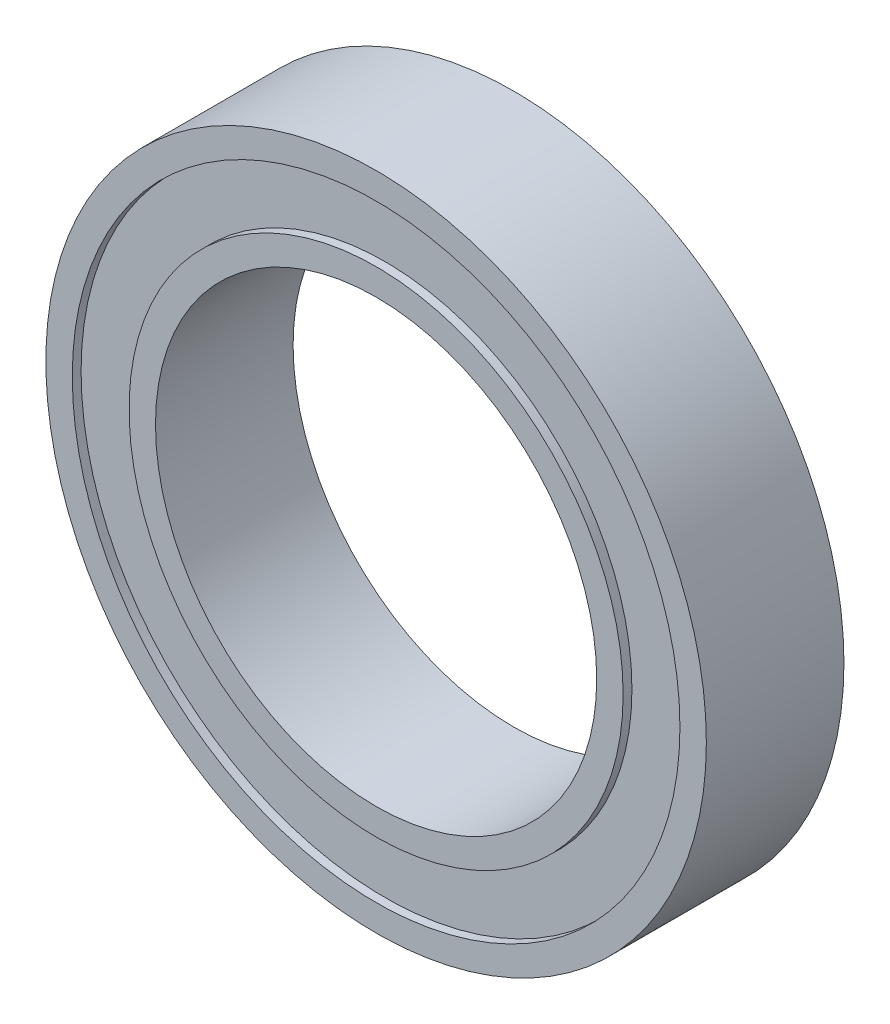
ISO-10303-21;
HEADER;
FILE_DESCRIPTION(('STEP AP214'),'2;1');
FILE_NAME('part.step','',(''),(''),'','','');
FILE_SCHEMA(('AUTOMOTIVE_DESIGN { 1 0 10303 214 1 1 1 1 }'));
ENDSEC;
DATA;
#1=APPLICATION_CONTEXT('core data for automotive mechanical design processes');
#2=APPLICATION_PROTOCOL_DEFINITION('international standard','automotive_design',2000,#1);
#3=PRODUCT_CONTEXT('',#1,'mechanical');
#4=PRODUCT('Part','Part','',(#3));
#5=PRODUCT_RELATED_PRODUCT_CATEGORY('part','',(#4));
#6=PRODUCT_DEFINITION_FORMATION('','',#4);
#7=PRODUCT_DEFINITION_CONTEXT('part definition',#1,'design');
#8=PRODUCT_DEFINITION('design','',#6,#7);
#9=PRODUCT_DEFINITION_SHAPE('','',#8);
#10=(LENGTH_UNIT() NAMED_UNIT(*) SI_UNIT(.MILLI.,.METRE.));
#11=(NAMED_UNIT(*) PLANE_ANGLE_UNIT() SI_UNIT($,.RADIAN.));
#12=(NAMED_UNIT(*) SI_UNIT($,.STERADIAN.) SOLID_ANGLE_UNIT());
#13=UNCERTAINTY_MEASURE_WITH_UNIT(LENGTH_MEASURE(1.E-05),#10,'distance_accuracy_value','');
#14=(GEOMETRIC_REPRESENTATION_CONTEXT(3) GLOBAL_UNCERTAINTY_ASSIGNED_CONTEXT((#13)) GLOBAL_UNIT_ASSIGNED_CONTEXT((#10,
#11,#12)) REPRESENTATION_CONTEXT('',''));
#15=CARTESIAN_POINT('',(0.,0.,0.));
#16=DIRECTION('',(0.,0.,1.));
#17=DIRECTION('',(1.,0.,0.));
#18=AXIS2_PLACEMENT_3D('',#15,#16,#17);
#19=CARTESIAN_POINT('',(0.,0.,-1.984375));
#20=DIRECTION('',(0.,0.,1.));
#21=DIRECTION('',(1.,0.,0.));
#22=AXIS2_PLACEMENT_3D('',#19,#20,#21);
#23=PLANE('',#22);
#24=CARTESIAN_POINT('',(0.,0.,-1.984375));
#25=DIRECTION('',(0.,0.,1.));
#26=DIRECTION('',(1.,0.,0.));
#27=AXIS2_PLACEMENT_3D('',#24,#25,#26);
#28=CIRCLE('',#27,9.525);
#29=CARTESIAN_POINT('',(9.525,0.,-1.984375));
#30=VERTEX_POINT('',#29);
#31=EDGE_CURVE('E39',#30,#30,#28,.T.);
#32=ORIENTED_EDGE('',*,*,#31,.F.);
#33=EDGE_LOOP('',(#32));
#34=FACE_BOUND('',#33,.T.);
#35=CARTESIAN_POINT('',(0.,0.,-1.984375));
#36=DIRECTION('',(0.,0.,1.));
#37=DIRECTION('',(1.,0.,0.));
#38=AXIS2_PLACEMENT_3D('',#35,#36,#37);
#39=CIRCLE('',#38,8.763);
#40=CARTESIAN_POINT('',(8.763,0.,-1.984375));
#41=VERTEX_POINT('',#40);
#42=EDGE_CURVE('E66',#41,#41,#39,.T.);
#43=ORIENTED_EDGE('',*,*,#42,.T.);
#44=EDGE_LOOP('',(#43));
#45=FACE_BOUND('',#44,.T.);
#46=ADVANCED_FACE('F35',(#34,#45),#23,.F.);
#47=CARTESIAN_POINT('',(0.,0.,1.984375));
#48=DIRECTION('',(0.,0.,1.));
#49=DIRECTION('',(1.,0.,0.));
#50=AXIS2_PLACEMENT_3D('',#47,#48,#49);
#51=PLANE('',#50);
#52=CARTESIAN_POINT('',(0.,0.,1.984375));
#53=DIRECTION('',(0.,0.,1.));
#54=DIRECTION('',(1.,0.,0.));
#55=AXIS2_PLACEMENT_3D('',#52,#53,#54);
#56=CIRCLE('',#55,6.3627);
#57=CARTESIAN_POINT('',(6.3627,0.,1.984375));
#58=VERTEX_POINT('',#57);
#59=EDGE_CURVE('E46',#58,#58,#56,.T.);
#60=ORIENTED_EDGE('',*,*,#59,.F.);
#61=EDGE_LOOP('',(#60));
#62=FACE_BOUND('',#61,.T.);
#63=CARTESIAN_POINT('',(0.,0.,1.984375));
#64=DIRECTION('',(0.,0.,1.));
#65=DIRECTION('',(1.,0.,0.));
#66=AXIS2_PLACEMENT_3D('',#63,#64,#65);
#67=CIRCLE('',#66,7.1247);
#68=CARTESIAN_POINT('',(7.1247,0.,1.984375));
#69=VERTEX_POINT('',#68);
#70=EDGE_CURVE('E60',#69,#69,#67,.T.);
#71=ORIENTED_EDGE('',*,*,#70,.T.);
#72=EDGE_LOOP('',(#71));
#73=FACE_BOUND('',#72,.T.);
#74=ADVANCED_FACE('F108',(#62,#73),#51,.T.);
#75=CARTESIAN_POINT('',(0.,0.,1.984375));
#76=DIRECTION('',(0.,0.,1.));
#77=DIRECTION('',(1.,0.,0.));
#78=AXIS2_PLACEMENT_3D('',#75,#76,#77);
#79=CIRCLE('',#78,8.763);
#80=CARTESIAN_POINT('',(8.763,0.,1.984375));
#81=VERTEX_POINT('',#80);
#82=EDGE_CURVE('E54',#81,#81,#79,.T.);
#83=ORIENTED_EDGE('',*,*,#82,.F.);
#84=EDGE_LOOP('',(#83));
#85=FACE_BOUND('',#84,.T.);
#86=CARTESIAN_POINT('',(0.,0.,1.984375));
#87=DIRECTION('',(0.,0.,1.));
#88=DIRECTION('',(1.,0.,0.));
#89=AXIS2_PLACEMENT_3D('',#86,#87,#88);
#90=CIRCLE('',#89,9.525);
#91=CARTESIAN_POINT('',(9.525,0.,1.984375));
#92=VERTEX_POINT('',#91);
#93=EDGE_CURVE('E10',#92,#92,#90,.T.);
#94=ORIENTED_EDGE('',*,*,#93,.T.);
#95=EDGE_LOOP('',(#94));
#96=FACE_BOUND('',#95,.T.);
#97=ADVANCED_FACE('F90',(#85,#96),#51,.T.);
#98=CARTESIAN_POINT('',(0.,0.,-1.984375));
#99=DIRECTION('',(0.,0.,1.));
#100=DIRECTION('',(1.,0.,0.));
#101=AXIS2_PLACEMENT_3D('',#98,#99,#100);
#102=CIRCLE('',#101,7.1247);
#103=CARTESIAN_POINT('',(7.1247,0.,-1.984375));
#104=VERTEX_POINT('',#103);
#105=EDGE_CURVE('E72',#104,#104,#102,.T.);
#106=ORIENTED_EDGE('',*,*,#105,.F.);
#107=EDGE_LOOP('',(#106));
#108=FACE_BOUND('',#107,.T.);
#109=CARTESIAN_POINT('',(0.,0.,-1.984375));
#110=DIRECTION('',(0.,0.,1.));
#111=DIRECTION('',(1.,0.,0.));
#112=AXIS2_PLACEMENT_3D('',#109,#110,#111);
#113=CIRCLE('',#112,6.3627);
#114=CARTESIAN_POINT('',(6.3627,0.,-1.984375));
#115=VERTEX_POINT('',#114);
#116=EDGE_CURVE('E48',#115,#115,#113,.T.);
#117=ORIENTED_EDGE('',*,*,#116,.T.);
#118=EDGE_LOOP('',(#117));
#119=FACE_BOUND('',#118,.T.);
#120=ADVANCED_FACE('F87',(#108,#119),#23,.F.);
#121=CARTESIAN_POINT('',(0.,0.,1.984375));
#122=DIRECTION('',(0.,0.,-1.));
#123=DIRECTION('',(-1.,0.,0.));
#124=AXIS2_PLACEMENT_3D('',#121,#122,#123);
#125=CYLINDRICAL_SURFACE('',#124,9.525);
#126=ORIENTED_EDGE('',*,*,#93,.F.);
#127=EDGE_LOOP('',(#126));
#128=FACE_BOUND('',#127,.T.);
#129=ORIENTED_EDGE('',*,*,#31,.T.);
#130=EDGE_LOOP('',(#129));
#131=FACE_BOUND('',#130,.T.);
#132=ADVANCED_FACE('F37',(#128,#131),#125,.T.);
#133=CARTESIAN_POINT('',(0.,0.,1.984375));
#134=DIRECTION('',(0.,0.,-1.));
#135=DIRECTION('',(-1.,0.,0.));
#136=AXIS2_PLACEMENT_3D('',#133,#134,#135);
#137=CYLINDRICAL_SURFACE('',#136,6.3627);
#138=ORIENTED_EDGE('',*,*,#59,.T.);
#139=EDGE_LOOP('',(#138));
#140=FACE_BOUND('',#139,.T.);
#141=ORIENTED_EDGE('',*,*,#116,.F.);
#142=EDGE_LOOP('',(#141));
#143=FACE_BOUND('',#142,.T.);
#144=ADVANCED_FACE('F93',(#140,#143),#137,.F.);
#145=CARTESIAN_POINT('',(0.,0.,1.730375));
#146=DIRECTION('',(0.,0.,1.));
#147=DIRECTION('',(1.,0.,0.));
#148=AXIS2_PLACEMENT_3D('',#145,#146,#147);
#149=CYLINDRICAL_SURFACE('',#148,8.763);
#150=CARTESIAN_POINT('',(0.,0.,1.730375));
#151=DIRECTION('',(0.,0.,1.));
#152=DIRECTION('',(1.,0.,0.));
#153=AXIS2_PLACEMENT_3D('',#150,#151,#152);
#154=CIRCLE('',#153,8.763);
#155=CARTESIAN_POINT('',(8.763,0.,1.730375));
#156=VERTEX_POINT('',#155);
#157=EDGE_CURVE('E51',#156,#156,#154,.T.);
#158=ORIENTED_EDGE('',*,*,#157,.F.);
#159=EDGE_LOOP('',(#158));
#160=FACE_BOUND('',#159,.T.);
#161=ORIENTED_EDGE('',*,*,#82,.T.);
#162=EDGE_LOOP('',(#161));
#163=FACE_BOUND('',#162,.T.);
#164=ADVANCED_FACE('F95',(#160,#163),#149,.F.);
#165=CARTESIAN_POINT('',(0.,0.,1.730375));
#166=DIRECTION('',(0.,0.,1.));
#167=DIRECTION('',(1.,0.,0.));
#168=AXIS2_PLACEMENT_3D('',#165,#166,#167);
#169=PLANE('',#168);
#170=CARTESIAN_POINT('',(0.,0.,1.730375));
#171=DIRECTION('',(0.,0.,1.));
#172=DIRECTION('',(1.,0.,0.));
#173=AXIS2_PLACEMENT_3D('',#170,#171,#172);
#174=CIRCLE('',#173,7.1247);
#175=CARTESIAN_POINT('',(7.1247,0.,1.730375));
#176=VERTEX_POINT('',#175);
#177=EDGE_CURVE('E57',#176,#176,#174,.T.);
#178=ORIENTED_EDGE('',*,*,#177,.F.);
#179=EDGE_LOOP('',(#178));
#180=FACE_BOUND('',#179,.T.);
#181=ORIENTED_EDGE('',*,*,#157,.T.);
#182=EDGE_LOOP('',(#181));
#183=FACE_BOUND('',#182,.T.);
#184=ADVANCED_FACE('F102',(#180,#183),#169,.T.);
#185=CARTESIAN_POINT('',(0.,0.,1.730375));
#186=DIRECTION('',(0.,0.,1.));
#187=DIRECTION('',(1.,0.,0.));
#188=AXIS2_PLACEMENT_3D('',#185,#186,#187);
#189=CYLINDRICAL_SURFACE('',#188,7.1247);
#190=ORIENTED_EDGE('',*,*,#177,.T.);
#191=EDGE_LOOP('',(#190));
#192=FACE_BOUND('',#191,.T.);
#193=ORIENTED_EDGE('',*,*,#70,.F.);
#194=EDGE_LOOP('',(#193));
#195=FACE_BOUND('',#194,.T.);
#196=ADVANCED_FACE('F156',(#192,#195),#189,.T.);
#197=CARTESIAN_POINT('',(0.,0.,-1.730375));
#198=DIRECTION('',(0.,0.,-1.));
#199=DIRECTION('',(1.,0.,0.));
#200=AXIS2_PLACEMENT_3D('',#197,#198,#199);
#201=PLANE('',#200);
#202=CARTESIAN_POINT('',(0.,0.,-1.730375));
#203=DIRECTION('',(0.,0.,1.));
#204=DIRECTION('',(1.,0.,0.));
#205=AXIS2_PLACEMENT_3D('',#202,#203,#204);
#206=CIRCLE('',#205,8.763);
#207=CARTESIAN_POINT('',(8.763,0.,-1.730375));
#208=VERTEX_POINT('',#207);
#209=EDGE_CURVE('E63',#208,#208,#206,.T.);
#210=ORIENTED_EDGE('',*,*,#209,.F.);
#211=EDGE_LOOP('',(#210));
#212=FACE_BOUND('',#211,.T.);
#213=CARTESIAN_POINT('',(0.,0.,-1.730375));
#214=DIRECTION('',(0.,0.,1.));
#215=DIRECTION('',(1.,0.,0.));
#216=AXIS2_PLACEMENT_3D('',#213,#214,#215);
#217=CIRCLE('',#216,7.1247);
#218=CARTESIAN_POINT('',(7.1247,0.,-1.730375));
#219=VERTEX_POINT('',#218);
#220=EDGE_CURVE('E69',#219,#219,#217,.T.);
#221=ORIENTED_EDGE('',*,*,#220,.T.);
#222=EDGE_LOOP('',(#221));
#223=FACE_BOUND('',#222,.T.);
#224=ADVANCED_FACE('F78',(#212,#223),#201,.T.);
#225=CARTESIAN_POINT('',(0.,0.,-1.730375));
#226=DIRECTION('',(0.,0.,-1.));
#227=DIRECTION('',(-1.,0.,0.));
#228=AXIS2_PLACEMENT_3D('',#225,#226,#227);
#229=CYLINDRICAL_SURFACE('',#228,8.763);
#230=ORIENTED_EDGE('',*,*,#209,.T.);
#231=EDGE_LOOP('',(#230));
#232=FACE_BOUND('',#231,.T.);
#233=ORIENTED_EDGE('',*,*,#42,.F.);
#234=EDGE_LOOP('',(#233));
#235=FACE_BOUND('',#234,.T.);
#236=ADVANCED_FACE('F83',(#232,#235),#229,.F.);
#237=CARTESIAN_POINT('',(0.,0.,-1.730375));
#238=DIRECTION('',(0.,0.,-1.));
#239=DIRECTION('',(-1.,0.,0.));
#240=AXIS2_PLACEMENT_3D('',#237,#238,#239);
#241=CYLINDRICAL_SURFACE('',#240,7.1247);
#242=ORIENTED_EDGE('',*,*,#220,.F.);
#243=EDGE_LOOP('',(#242));
#244=FACE_BOUND('',#243,.T.);
#245=ORIENTED_EDGE('',*,*,#105,.T.);
#246=EDGE_LOOP('',(#245));
#247=FACE_BOUND('',#246,.T.);
#248=ADVANCED_FACE('F80',(#244,#247),#241,.T.);
#249=CLOSED_SHELL('',(#46,#74,#97,#120,#132,#144,#164,#184,#196,#224,#236,#248));
#250=MANIFOLD_SOLID_BREP('B2',#249);
#251=ADVANCED_BREP_SHAPE_REPRESENTATION('',(#18,#250),#14);
#252=SHAPE_DEFINITION_REPRESENTATION(#9,#251);
ENDSEC;
END-ISO-10303-21;
